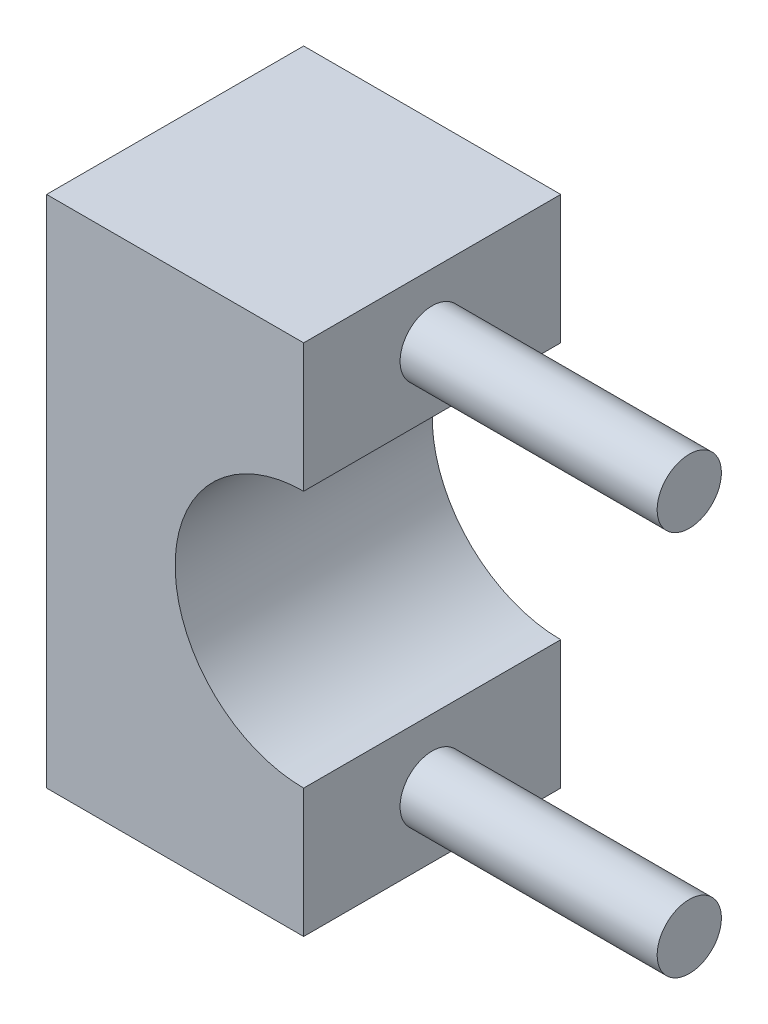
ISO-10303-21;
HEADER;
FILE_DESCRIPTION(('STEP AP214'),'2;1');
FILE_NAME('part.step','',(''),(''),'','','');
FILE_SCHEMA(('AUTOMOTIVE_DESIGN { 1 0 10303 214 1 1 1 1 }'));
ENDSEC;
DATA;
#1=APPLICATION_CONTEXT('core data for automotive mechanical design processes');
#2=APPLICATION_PROTOCOL_DEFINITION('international standard','automotive_design',2000,#1);
#3=PRODUCT_CONTEXT('',#1,'mechanical');
#4=PRODUCT('Part','Part','',(#3));
#5=PRODUCT_RELATED_PRODUCT_CATEGORY('part','',(#4));
#6=PRODUCT_DEFINITION_FORMATION('','',#4);
#7=PRODUCT_DEFINITION_CONTEXT('part definition',#1,'design');
#8=PRODUCT_DEFINITION('design','',#6,#7);
#9=PRODUCT_DEFINITION_SHAPE('','',#8);
#10=(LENGTH_UNIT() NAMED_UNIT(*) SI_UNIT(.MILLI.,.METRE.));
#11=(NAMED_UNIT(*) PLANE_ANGLE_UNIT() SI_UNIT($,.RADIAN.));
#12=(NAMED_UNIT(*) SI_UNIT($,.STERADIAN.) SOLID_ANGLE_UNIT());
#13=UNCERTAINTY_MEASURE_WITH_UNIT(LENGTH_MEASURE(1.E-05),#10,'distance_accuracy_value','');
#14=(GEOMETRIC_REPRESENTATION_CONTEXT(3) GLOBAL_UNCERTAINTY_ASSIGNED_CONTEXT((#13)) GLOBAL_UNIT_ASSIGNED_CONTEXT((#10,
#11,#12)) REPRESENTATION_CONTEXT('',''));
#15=CARTESIAN_POINT('',(0.,0.,0.));
#16=DIRECTION('',(0.,0.,1.));
#17=DIRECTION('',(1.,0.,0.));
#18=AXIS2_PLACEMENT_3D('',#15,#16,#17);
#19=CARTESIAN_POINT('',(0.,0.,20.));
#20=DIRECTION('',(0.,0.,-1.));
#21=DIRECTION('',(-1.,0.,0.));
#22=AXIS2_PLACEMENT_3D('',#19,#20,#21);
#23=CYLINDRICAL_SURFACE('',#22,10.);
#24=CARTESIAN_POINT('',(0.,0.,0.));
#25=DIRECTION('',(0.,0.,-1.));
#26=DIRECTION('',(1.,0.,0.));
#27=AXIS2_PLACEMENT_3D('',#24,#25,#26);
#28=CIRCLE('',#27,10.);
#29=CARTESIAN_POINT('',(0.,-10.,0.));
#30=VERTEX_POINT('',#29);
#31=CARTESIAN_POINT('',(0.,10.,0.));
#32=VERTEX_POINT('',#31);
#33=EDGE_CURVE('E129',#30,#32,#28,.T.);
#34=ORIENTED_EDGE('',*,*,#33,.T.);
#35=DIRECTION('',(0.,0.,-1.));
#36=VECTOR('',#35,1.);
#37=CARTESIAN_POINT('',(0.,10.,20.));
#38=LINE('',#37,#36);
#39=CARTESIAN_POINT('',(0.,10.,20.));
#40=VERTEX_POINT('',#39);
#41=EDGE_CURVE('E157',#40,#32,#38,.T.);
#42=ORIENTED_EDGE('',*,*,#41,.F.);
#43=CARTESIAN_POINT('',(0.,0.,20.));
#44=DIRECTION('',(0.,0.,-1.));
#45=DIRECTION('',(1.,0.,0.));
#46=AXIS2_PLACEMENT_3D('',#43,#44,#45);
#47=CIRCLE('',#46,10.);
#48=CARTESIAN_POINT('',(0.,-10.,20.));
#49=VERTEX_POINT('',#48);
#50=EDGE_CURVE('E146',#49,#40,#47,.T.);
#51=ORIENTED_EDGE('',*,*,#50,.F.);
#52=DIRECTION('',(0.,0.,-1.));
#53=VECTOR('',#52,1.);
#54=CARTESIAN_POINT('',(0.,-10.,20.));
#55=LINE('',#54,#53);
#56=EDGE_CURVE('E125',#49,#30,#55,.T.);
#57=ORIENTED_EDGE('',*,*,#56,.T.);
#58=EDGE_LOOP('',(#34,#42,#51,#57));
#59=FACE_BOUND('',#58,.T.);
#60=ADVANCED_FACE('F39',(#59),#23,.F.);
#61=CARTESIAN_POINT('',(0.,20.,20.));
#62=DIRECTION('',(-1.,0.,0.));
#63=DIRECTION('',(0.,0.,1.));
#64=AXIS2_PLACEMENT_3D('',#61,#62,#63);
#65=PLANE('',#64);
#66=CARTESIAN_POINT('',(0.,15.,10.));
#67=DIRECTION('',(-1.,0.,0.));
#68=DIRECTION('',(0.,0.,1.));
#69=AXIS2_PLACEMENT_3D('',#66,#67,#68);
#70=CIRCLE('',#69,2.5);
#71=CARTESIAN_POINT('',(0.,15.,12.5));
#72=VERTEX_POINT('',#71);
#73=EDGE_CURVE('E48',#72,#72,#70,.F.);
#74=ORIENTED_EDGE('',*,*,#73,.F.);
#75=EDGE_LOOP('',(#74));
#76=FACE_BOUND('',#75,.T.);
#77=DIRECTION('',(0.,1.,0.));
#78=VECTOR('',#77,1.);
#79=CARTESIAN_POINT('',(0.,20.,0.));
#80=LINE('',#79,#78);
#81=CARTESIAN_POINT('',(0.,20.,0.));
#82=VERTEX_POINT('',#81);
#83=EDGE_CURVE('E133',#32,#82,#80,.T.);
#84=ORIENTED_EDGE('',*,*,#83,.T.);
#85=DIRECTION('',(0.,0.,-1.));
#86=VECTOR('',#85,1.);
#87=CARTESIAN_POINT('',(0.,20.,20.));
#88=LINE('',#87,#86);
#89=CARTESIAN_POINT('',(0.,20.,20.));
#90=VERTEX_POINT('',#89);
#91=EDGE_CURVE('E153',#90,#82,#88,.T.);
#92=ORIENTED_EDGE('',*,*,#91,.F.);
#93=DIRECTION('',(0.,1.,0.));
#94=VECTOR('',#93,1.);
#95=CARTESIAN_POINT('',(0.,20.,20.));
#96=LINE('',#95,#94);
#97=EDGE_CURVE('E94',#40,#90,#96,.T.);
#98=ORIENTED_EDGE('',*,*,#97,.F.);
#99=ORIENTED_EDGE('',*,*,#41,.T.);
#100=EDGE_LOOP('',(#84,#92,#98,#99));
#101=FACE_BOUND('',#100,.T.);
#102=ADVANCED_FACE('F165',(#76,#101),#65,.F.);
#103=CARTESIAN_POINT('',(-20.,20.,20.));
#104=DIRECTION('',(0.,-1.,0.));
#105=DIRECTION('',(0.,0.,-1.));
#106=AXIS2_PLACEMENT_3D('',#103,#104,#105);
#107=PLANE('',#106);
#108=DIRECTION('',(-1.,0.,0.));
#109=VECTOR('',#108,1.);
#110=CARTESIAN_POINT('',(-20.,20.,0.));
#111=LINE('',#110,#109);
#112=CARTESIAN_POINT('',(-20.,20.,0.));
#113=VERTEX_POINT('',#112);
#114=EDGE_CURVE('E137',#82,#113,#111,.T.);
#115=ORIENTED_EDGE('',*,*,#114,.T.);
#116=DIRECTION('',(0.,0.,-1.));
#117=VECTOR('',#116,1.);
#118=CARTESIAN_POINT('',(-20.,20.,20.));
#119=LINE('',#118,#117);
#120=CARTESIAN_POINT('',(-20.,20.,20.));
#121=VERTEX_POINT('',#120);
#122=EDGE_CURVE('E118',#121,#113,#119,.T.);
#123=ORIENTED_EDGE('',*,*,#122,.F.);
#124=DIRECTION('',(-1.,0.,0.));
#125=VECTOR('',#124,1.);
#126=CARTESIAN_POINT('',(-20.,20.,20.));
#127=LINE('',#126,#125);
#128=EDGE_CURVE('E107',#90,#121,#127,.T.);
#129=ORIENTED_EDGE('',*,*,#128,.F.);
#130=ORIENTED_EDGE('',*,*,#91,.T.);
#131=EDGE_LOOP('',(#115,#123,#129,#130));
#132=FACE_BOUND('',#131,.T.);
#133=ADVANCED_FACE('F167',(#132),#107,.F.);
#134=CARTESIAN_POINT('',(-20.,20.,20.));
#135=DIRECTION('',(1.,0.,0.));
#136=DIRECTION('',(0.,0.,-1.));
#137=AXIS2_PLACEMENT_3D('',#134,#135,#136);
#138=PLANE('',#137);
#139=DIRECTION('',(0.,-1.,0.));
#140=VECTOR('',#139,1.);
#141=CARTESIAN_POINT('',(-20.,20.,0.));
#142=LINE('',#141,#140);
#143=CARTESIAN_POINT('',(-20.,-20.,0.));
#144=VERTEX_POINT('',#143);
#145=EDGE_CURVE('E116',#113,#144,#142,.T.);
#146=ORIENTED_EDGE('',*,*,#145,.T.);
#147=DIRECTION('',(0.,0.,-1.));
#148=VECTOR('',#147,1.);
#149=CARTESIAN_POINT('',(-20.,-20.,20.));
#150=LINE('',#149,#148);
#151=CARTESIAN_POINT('',(-20.,-20.,20.));
#152=VERTEX_POINT('',#151);
#153=EDGE_CURVE('E113',#152,#144,#150,.T.);
#154=ORIENTED_EDGE('',*,*,#153,.F.);
#155=DIRECTION('',(0.,-1.,0.));
#156=VECTOR('',#155,1.);
#157=CARTESIAN_POINT('',(-20.,20.,20.));
#158=LINE('',#157,#156);
#159=EDGE_CURVE('E101',#121,#152,#158,.T.);
#160=ORIENTED_EDGE('',*,*,#159,.F.);
#161=ORIENTED_EDGE('',*,*,#122,.T.);
#162=EDGE_LOOP('',(#146,#154,#160,#161));
#163=FACE_BOUND('',#162,.T.);
#164=ADVANCED_FACE('F114',(#163),#138,.F.);
#165=CARTESIAN_POINT('',(-20.,-20.,20.));
#166=DIRECTION('',(0.,1.,0.));
#167=DIRECTION('',(0.,0.,1.));
#168=AXIS2_PLACEMENT_3D('',#165,#166,#167);
#169=PLANE('',#168);
#170=DIRECTION('',(1.,0.,0.));
#171=VECTOR('',#170,1.);
#172=CARTESIAN_POINT('',(-20.,-20.,0.));
#173=LINE('',#172,#171);
#174=CARTESIAN_POINT('',(0.,-20.,0.));
#175=VERTEX_POINT('',#174);
#176=EDGE_CURVE('E79',#144,#175,#173,.T.);
#177=ORIENTED_EDGE('',*,*,#176,.T.);
#178=DIRECTION('',(0.,0.,-1.));
#179=VECTOR('',#178,1.);
#180=CARTESIAN_POINT('',(0.,-20.,20.));
#181=LINE('',#180,#179);
#182=CARTESIAN_POINT('',(0.,-20.,20.));
#183=VERTEX_POINT('',#182);
#184=EDGE_CURVE('E119',#183,#175,#181,.T.);
#185=ORIENTED_EDGE('',*,*,#184,.F.);
#186=DIRECTION('',(1.,0.,0.));
#187=VECTOR('',#186,1.);
#188=CARTESIAN_POINT('',(-20.,-20.,20.));
#189=LINE('',#188,#187);
#190=EDGE_CURVE('E105',#152,#183,#189,.T.);
#191=ORIENTED_EDGE('',*,*,#190,.F.);
#192=ORIENTED_EDGE('',*,*,#153,.T.);
#193=EDGE_LOOP('',(#177,#185,#191,#192));
#194=FACE_BOUND('',#193,.T.);
#195=ADVANCED_FACE('F121',(#194),#169,.F.);
#196=CARTESIAN_POINT('',(0.,-10.,20.));
#197=DIRECTION('',(-1.,0.,0.));
#198=DIRECTION('',(0.,0.,1.));
#199=AXIS2_PLACEMENT_3D('',#196,#197,#198);
#200=PLANE('',#199);
#201=CARTESIAN_POINT('',(0.,-15.,10.));
#202=DIRECTION('',(-1.,0.,0.));
#203=DIRECTION('',(0.,0.,1.));
#204=AXIS2_PLACEMENT_3D('',#201,#202,#203);
#205=CIRCLE('',#204,2.5);
#206=CARTESIAN_POINT('',(0.,-15.,12.5));
#207=VERTEX_POINT('',#206);
#208=EDGE_CURVE('E11',#207,#207,#205,.F.);
#209=ORIENTED_EDGE('',*,*,#208,.F.);
#210=EDGE_LOOP('',(#209));
#211=FACE_BOUND('',#210,.T.);
#212=DIRECTION('',(0.,1.,0.));
#213=VECTOR('',#212,1.);
#214=CARTESIAN_POINT('',(0.,-10.,0.));
#215=LINE('',#214,#213);
#216=EDGE_CURVE('E85',#175,#30,#215,.T.);
#217=ORIENTED_EDGE('',*,*,#216,.T.);
#218=ORIENTED_EDGE('',*,*,#56,.F.);
#219=DIRECTION('',(0.,1.,0.));
#220=VECTOR('',#219,1.);
#221=CARTESIAN_POINT('',(0.,-10.,20.));
#222=LINE('',#221,#220);
#223=EDGE_CURVE('E56',#183,#49,#222,.T.);
#224=ORIENTED_EDGE('',*,*,#223,.F.);
#225=ORIENTED_EDGE('',*,*,#184,.T.);
#226=EDGE_LOOP('',(#217,#218,#224,#225));
#227=FACE_BOUND('',#226,.T.);
#228=ADVANCED_FACE('F176',(#211,#227),#200,.F.);
#229=CARTESIAN_POINT('',(0.,0.,20.));
#230=DIRECTION('',(0.,0.,1.));
#231=DIRECTION('',(1.,0.,0.));
#232=AXIS2_PLACEMENT_3D('',#229,#230,#231);
#233=PLANE('',#232);
#234=ORIENTED_EDGE('',*,*,#50,.T.);
#235=ORIENTED_EDGE('',*,*,#97,.T.);
#236=ORIENTED_EDGE('',*,*,#128,.T.);
#237=ORIENTED_EDGE('',*,*,#159,.T.);
#238=ORIENTED_EDGE('',*,*,#190,.T.);
#239=ORIENTED_EDGE('',*,*,#223,.T.);
#240=EDGE_LOOP('',(#234,#235,#236,#237,#238,#239));
#241=FACE_BOUND('',#240,.T.);
#242=ADVANCED_FACE('F103',(#241),#233,.T.);
#243=CARTESIAN_POINT('',(0.,0.,0.));
#244=DIRECTION('',(0.,0.,1.));
#245=DIRECTION('',(1.,0.,0.));
#246=AXIS2_PLACEMENT_3D('',#243,#244,#245);
#247=PLANE('',#246);
#248=ORIENTED_EDGE('',*,*,#33,.F.);
#249=ORIENTED_EDGE('',*,*,#216,.F.);
#250=ORIENTED_EDGE('',*,*,#176,.F.);
#251=ORIENTED_EDGE('',*,*,#145,.F.);
#252=ORIENTED_EDGE('',*,*,#114,.F.);
#253=ORIENTED_EDGE('',*,*,#83,.F.);
#254=EDGE_LOOP('',(#248,#249,#250,#251,#252,#253));
#255=FACE_BOUND('',#254,.T.);
#256=ADVANCED_FACE('F173',(#255),#247,.F.);
#257=CARTESIAN_POINT('',(20.,15.,10.));
#258=DIRECTION('',(-1.,0.,0.));
#259=DIRECTION('',(0.,0.,1.));
#260=AXIS2_PLACEMENT_3D('',#257,#258,#259);
#261=CYLINDRICAL_SURFACE('',#260,2.5);
#262=CARTESIAN_POINT('',(20.,15.,10.));
#263=DIRECTION('',(1.,0.,0.));
#264=DIRECTION('',(0.,0.,-1.));
#265=AXIS2_PLACEMENT_3D('',#262,#263,#264);
#266=CIRCLE('',#265,2.5);
#267=CARTESIAN_POINT('',(20.,15.,7.5));
#268=VERTEX_POINT('',#267);
#269=EDGE_CURVE('E134',#268,#268,#266,.T.);
#270=ORIENTED_EDGE('',*,*,#269,.F.);
#271=EDGE_LOOP('',(#270));
#272=FACE_BOUND('',#271,.T.);
#273=ORIENTED_EDGE('',*,*,#73,.T.);
#274=EDGE_LOOP('',(#273));
#275=FACE_BOUND('',#274,.T.);
#276=ADVANCED_FACE('F163',(#272,#275),#261,.T.);
#277=CARTESIAN_POINT('',(20.,15.,10.));
#278=DIRECTION('',(1.,0.,0.));
#279=DIRECTION('',(0.,0.,-1.));
#280=AXIS2_PLACEMENT_3D('',#277,#278,#279);
#281=PLANE('',#280);
#282=ORIENTED_EDGE('',*,*,#269,.T.);
#283=EDGE_LOOP('',(#282));
#284=FACE_BOUND('',#283,.T.);
#285=ADVANCED_FACE('F234',(#284),#281,.T.);
#286=CARTESIAN_POINT('',(20.,-15.,10.));
#287=DIRECTION('',(-1.,0.,0.));
#288=DIRECTION('',(0.,0.,1.));
#289=AXIS2_PLACEMENT_3D('',#286,#287,#288);
#290=CYLINDRICAL_SURFACE('',#289,2.5);
#291=CARTESIAN_POINT('',(20.,-15.,10.));
#292=DIRECTION('',(1.,0.,0.));
#293=DIRECTION('',(0.,0.,-1.));
#294=AXIS2_PLACEMENT_3D('',#291,#292,#293);
#295=CIRCLE('',#294,2.5);
#296=CARTESIAN_POINT('',(20.,-15.,7.5));
#297=VERTEX_POINT('',#296);
#298=EDGE_CURVE('E270',#297,#297,#295,.T.);
#299=ORIENTED_EDGE('',*,*,#298,.F.);
#300=EDGE_LOOP('',(#299));
#301=FACE_BOUND('',#300,.T.);
#302=ORIENTED_EDGE('',*,*,#208,.T.);
#303=EDGE_LOOP('',(#302));
#304=FACE_BOUND('',#303,.T.);
#305=ADVANCED_FACE('F241',(#301,#304),#290,.T.);
#306=CARTESIAN_POINT('',(20.,-15.,10.));
#307=DIRECTION('',(1.,0.,0.));
#308=DIRECTION('',(0.,0.,-1.));
#309=AXIS2_PLACEMENT_3D('',#306,#307,#308);
#310=PLANE('',#309);
#311=ORIENTED_EDGE('',*,*,#298,.T.);
#312=EDGE_LOOP('',(#311));
#313=FACE_BOUND('',#312,.T.);
#314=ADVANCED_FACE('F249',(#313),#310,.T.);
#315=CLOSED_SHELL('',(#60,#102,#133,#164,#195,#228,#242,#256,#276,#285,#305,#314));
#316=MANIFOLD_SOLID_BREP('B2',#315);
#317=ADVANCED_BREP_SHAPE_REPRESENTATION('',(#18,#316),#14);
#318=SHAPE_DEFINITION_REPRESENTATION(#9,#317);
ENDSEC;
END-ISO-10303-21;
